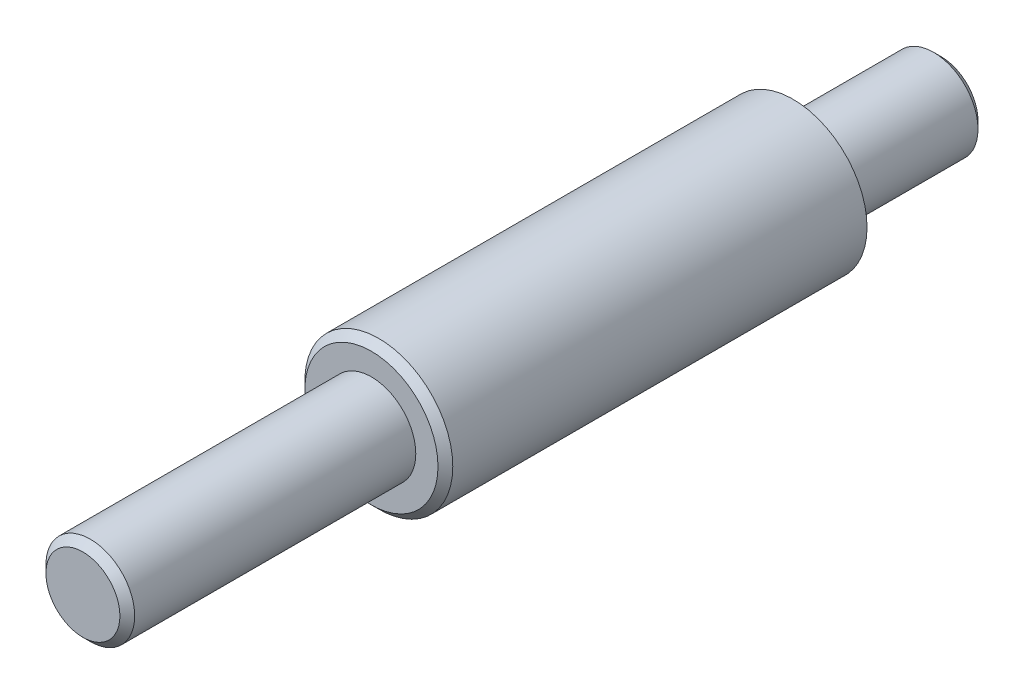
ISO-10303-21;
HEADER;
FILE_DESCRIPTION(('STEP AP214'),'2;1');
FILE_NAME('part.step','',(''),(''),'','','');
FILE_SCHEMA(('AUTOMOTIVE_DESIGN { 1 0 10303 214 1 1 1 1 }'));
ENDSEC;
DATA;
#1=APPLICATION_CONTEXT('core data for automotive mechanical design processes');
#2=APPLICATION_PROTOCOL_DEFINITION('international standard','automotive_design',2000,#1);
#3=PRODUCT_CONTEXT('',#1,'mechanical');
#4=PRODUCT('Part','Part','',(#3));
#5=PRODUCT_RELATED_PRODUCT_CATEGORY('part','',(#4));
#6=PRODUCT_DEFINITION_FORMATION('','',#4);
#7=PRODUCT_DEFINITION_CONTEXT('part definition',#1,'design');
#8=PRODUCT_DEFINITION('design','',#6,#7);
#9=PRODUCT_DEFINITION_SHAPE('','',#8);
#10=(LENGTH_UNIT() NAMED_UNIT(*) SI_UNIT(.MILLI.,.METRE.));
#11=(NAMED_UNIT(*) PLANE_ANGLE_UNIT() SI_UNIT($,.RADIAN.));
#12=(NAMED_UNIT(*) SI_UNIT($,.STERADIAN.) SOLID_ANGLE_UNIT());
#13=UNCERTAINTY_MEASURE_WITH_UNIT(LENGTH_MEASURE(1.E-05),#10,'distance_accuracy_value','');
#14=(GEOMETRIC_REPRESENTATION_CONTEXT(3) GLOBAL_UNCERTAINTY_ASSIGNED_CONTEXT((#13)) GLOBAL_UNIT_ASSIGNED_CONTEXT((#10,
#11,#12)) REPRESENTATION_CONTEXT('',''));
#15=CARTESIAN_POINT('',(0.,0.,0.));
#16=DIRECTION('',(0.,0.,1.));
#17=DIRECTION('',(1.,0.,0.));
#18=AXIS2_PLACEMENT_3D('',#15,#16,#17);
#19=CARTESIAN_POINT('',(0.,0.,0.500000000000001));
#20=DIRECTION('',(0.,0.,1.));
#21=DIRECTION('',(1.,0.,0.));
#22=AXIS2_PLACEMENT_3D('',#19,#20,#21);
#23=CONICAL_SURFACE('',#22,3.,0.78539816339744);
#24=CARTESIAN_POINT('',(0.,0.,0.));
#25=DIRECTION('',(0.,0.,1.));
#26=DIRECTION('',(1.,0.,0.));
#27=AXIS2_PLACEMENT_3D('',#24,#25,#26);
#28=CIRCLE('',#27,2.50000000000001);
#29=CARTESIAN_POINT('',(2.5,0.,0.));
#30=VERTEX_POINT('',#29);
#31=EDGE_CURVE('E69',#30,#30,#28,.T.);
#32=ORIENTED_EDGE('',*,*,#31,.T.);
#33=EDGE_LOOP('',(#32));
#34=FACE_BOUND('',#33,.T.);
#35=CARTESIAN_POINT('',(0.,0.,0.500000000000001));
#36=DIRECTION('',(0.,0.,1.));
#37=DIRECTION('',(1.,0.,0.));
#38=AXIS2_PLACEMENT_3D('',#35,#36,#37);
#39=CIRCLE('',#38,3.);
#40=CARTESIAN_POINT('',(2.99999999999999,0.,0.5));
#41=VERTEX_POINT('',#40);
#42=EDGE_CURVE('E10',#41,#41,#39,.T.);
#43=ORIENTED_EDGE('',*,*,#42,.F.);
#44=EDGE_LOOP('',(#43));
#45=FACE_BOUND('',#44,.T.);
#46=ADVANCED_FACE('F39',(#34,#45),#23,.T.);
#47=CARTESIAN_POINT('',(0.,0.,0.));
#48=DIRECTION('',(0.,0.,1.));
#49=DIRECTION('',(1.,0.,0.));
#50=AXIS2_PLACEMENT_3D('',#47,#48,#49);
#51=CYLINDRICAL_SURFACE('',#50,3.);
#52=ORIENTED_EDGE('',*,*,#42,.T.);
#53=EDGE_LOOP('',(#52));
#54=FACE_BOUND('',#53,.T.);
#55=CARTESIAN_POINT('',(0.,0.,10.));
#56=DIRECTION('',(0.,0.,1.));
#57=DIRECTION('',(1.,0.,0.));
#58=AXIS2_PLACEMENT_3D('',#55,#56,#57);
#59=CIRCLE('',#58,3.);
#60=CARTESIAN_POINT('',(2.99999999999999,0.,10.));
#61=VERTEX_POINT('',#60);
#62=EDGE_CURVE('E44',#61,#61,#59,.T.);
#63=ORIENTED_EDGE('',*,*,#62,.F.);
#64=EDGE_LOOP('',(#63));
#65=FACE_BOUND('',#64,.T.);
#66=ADVANCED_FACE('F90',(#54,#65),#51,.T.);
#67=CARTESIAN_POINT('',(4.99999999999999,0.,10.));
#68=DIRECTION('',(0.,0.,-1.));
#69=DIRECTION('',(-1.,0.,0.));
#70=AXIS2_PLACEMENT_3D('',#67,#68,#69);
#71=PLANE('',#70);
#72=ORIENTED_EDGE('',*,*,#62,.T.);
#73=EDGE_LOOP('',(#72));
#74=FACE_BOUND('',#73,.T.);
#75=CARTESIAN_POINT('',(0.,0.,10.));
#76=DIRECTION('',(0.,0.,1.));
#77=DIRECTION('',(1.,0.,0.));
#78=AXIS2_PLACEMENT_3D('',#75,#76,#77);
#79=CIRCLE('',#78,5.);
#80=CARTESIAN_POINT('',(4.99999999999999,0.,10.));
#81=VERTEX_POINT('',#80);
#82=EDGE_CURVE('E47',#81,#81,#79,.T.);
#83=ORIENTED_EDGE('',*,*,#82,.F.);
#84=EDGE_LOOP('',(#83));
#85=FACE_BOUND('',#84,.T.);
#86=ADVANCED_FACE('F91',(#74,#85),#71,.T.);
#87=CARTESIAN_POINT('',(0.,0.,0.));
#88=DIRECTION('',(0.,0.,1.));
#89=DIRECTION('',(1.,0.,0.));
#90=AXIS2_PLACEMENT_3D('',#87,#88,#89);
#91=CYLINDRICAL_SURFACE('',#90,5.);
#92=ORIENTED_EDGE('',*,*,#82,.T.);
#93=EDGE_LOOP('',(#92));
#94=FACE_BOUND('',#93,.T.);
#95=CARTESIAN_POINT('',(0.,0.,38.));
#96=DIRECTION('',(0.,0.,1.));
#97=DIRECTION('',(1.,0.,0.));
#98=AXIS2_PLACEMENT_3D('',#95,#96,#97);
#99=CIRCLE('',#98,5.);
#100=CARTESIAN_POINT('',(5.,0.,38.));
#101=VERTEX_POINT('',#100);
#102=EDGE_CURVE('E52',#101,#101,#99,.T.);
#103=ORIENTED_EDGE('',*,*,#102,.F.);
#104=EDGE_LOOP('',(#103));
#105=FACE_BOUND('',#104,.T.);
#106=ADVANCED_FACE('F95',(#94,#105),#91,.T.);
#107=CARTESIAN_POINT('',(0.,0.,38.5));
#108=DIRECTION('',(0.,0.,-1.));
#109=DIRECTION('',(-1.,0.,0.));
#110=AXIS2_PLACEMENT_3D('',#107,#108,#109);
#111=CONICAL_SURFACE('',#110,4.5,0.785398163397448);
#112=ORIENTED_EDGE('',*,*,#102,.T.);
#113=EDGE_LOOP('',(#112));
#114=FACE_BOUND('',#113,.T.);
#115=CARTESIAN_POINT('',(0.,0.,38.5));
#116=DIRECTION('',(0.,0.,1.));
#117=DIRECTION('',(1.,0.,0.));
#118=AXIS2_PLACEMENT_3D('',#115,#116,#117);
#119=CIRCLE('',#118,4.5);
#120=CARTESIAN_POINT('',(4.5,0.,38.5));
#121=VERTEX_POINT('',#120);
#122=EDGE_CURVE('E59',#121,#121,#119,.T.);
#123=ORIENTED_EDGE('',*,*,#122,.F.);
#124=EDGE_LOOP('',(#123));
#125=FACE_BOUND('',#124,.T.);
#126=ADVANCED_FACE('F103',(#114,#125),#111,.T.);
#127=CARTESIAN_POINT('',(2.99999999999999,0.,38.5));
#128=DIRECTION('',(0.,0.,1.));
#129=DIRECTION('',(1.,0.,0.));
#130=AXIS2_PLACEMENT_3D('',#127,#128,#129);
#131=PLANE('',#130);
#132=ORIENTED_EDGE('',*,*,#122,.T.);
#133=EDGE_LOOP('',(#132));
#134=FACE_BOUND('',#133,.T.);
#135=CARTESIAN_POINT('',(0.,0.,38.5));
#136=DIRECTION('',(0.,0.,1.));
#137=DIRECTION('',(1.,0.,0.));
#138=AXIS2_PLACEMENT_3D('',#135,#136,#137);
#139=CIRCLE('',#138,2.99999999999999);
#140=CARTESIAN_POINT('',(2.99999999999999,0.,38.5));
#141=VERTEX_POINT('',#140);
#142=EDGE_CURVE('E62',#141,#141,#139,.T.);
#143=ORIENTED_EDGE('',*,*,#142,.F.);
#144=EDGE_LOOP('',(#143));
#145=FACE_BOUND('',#144,.T.);
#146=ADVANCED_FACE('F102',(#134,#145),#131,.T.);
#147=CARTESIAN_POINT('',(0.,0.,0.));
#148=DIRECTION('',(0.,0.,1.));
#149=DIRECTION('',(1.,0.,0.));
#150=AXIS2_PLACEMENT_3D('',#147,#148,#149);
#151=CYLINDRICAL_SURFACE('',#150,2.99999999999999);
#152=ORIENTED_EDGE('',*,*,#142,.T.);
#153=EDGE_LOOP('',(#152));
#154=FACE_BOUND('',#153,.T.);
#155=CARTESIAN_POINT('',(0.,0.,57.5));
#156=DIRECTION('',(0.,0.,1.));
#157=DIRECTION('',(1.,0.,0.));
#158=AXIS2_PLACEMENT_3D('',#155,#156,#157);
#159=CIRCLE('',#158,3.);
#160=CARTESIAN_POINT('',(3.,0.,57.5));
#161=VERTEX_POINT('',#160);
#162=EDGE_CURVE('E61',#161,#161,#159,.T.);
#163=ORIENTED_EDGE('',*,*,#162,.F.);
#164=EDGE_LOOP('',(#163));
#165=FACE_BOUND('',#164,.T.);
#166=ADVANCED_FACE('F107',(#154,#165),#151,.T.);
#167=CARTESIAN_POINT('',(0.,0.,58.));
#168=DIRECTION('',(0.,0.,-1.));
#169=DIRECTION('',(-1.,0.,0.));
#170=AXIS2_PLACEMENT_3D('',#167,#168,#169);
#171=CONICAL_SURFACE('',#170,2.5,0.785398163397444);
#172=ORIENTED_EDGE('',*,*,#162,.T.);
#173=EDGE_LOOP('',(#172));
#174=FACE_BOUND('',#173,.T.);
#175=CARTESIAN_POINT('',(0.,0.,58.));
#176=DIRECTION('',(0.,0.,1.));
#177=DIRECTION('',(1.,0.,0.));
#178=AXIS2_PLACEMENT_3D('',#175,#176,#177);
#179=CIRCLE('',#178,2.5);
#180=CARTESIAN_POINT('',(2.5,0.,58.));
#181=VERTEX_POINT('',#180);
#182=EDGE_CURVE('E70',#181,#181,#179,.T.);
#183=ORIENTED_EDGE('',*,*,#182,.F.);
#184=EDGE_LOOP('',(#183));
#185=FACE_BOUND('',#184,.T.);
#186=ADVANCED_FACE('F84',(#174,#185),#171,.T.);
#187=CARTESIAN_POINT('',(0.,0.,58.));
#188=DIRECTION('',(0.,0.,1.));
#189=DIRECTION('',(1.,0.,0.));
#190=AXIS2_PLACEMENT_3D('',#187,#188,#189);
#191=PLANE('',#190);
#192=ORIENTED_EDGE('',*,*,#182,.T.);
#193=EDGE_LOOP('',(#192));
#194=FACE_BOUND('',#193,.T.);
#195=ADVANCED_FACE('F76',(#194),#191,.T.);
#196=CARTESIAN_POINT('',(2.5,0.,0.));
#197=DIRECTION('',(0.,0.,-1.));
#198=DIRECTION('',(-1.,0.,0.));
#199=AXIS2_PLACEMENT_3D('',#196,#197,#198);
#200=PLANE('',#199);
#201=ORIENTED_EDGE('',*,*,#31,.F.);
#202=EDGE_LOOP('',(#201));
#203=FACE_BOUND('',#202,.T.);
#204=ADVANCED_FACE('F77',(#203),#200,.T.);
#205=CLOSED_SHELL('',(#46,#66,#86,#106,#126,#146,#166,#186,#195,#204));
#206=MANIFOLD_SOLID_BREP('B2',#205);
#207=ADVANCED_BREP_SHAPE_REPRESENTATION('',(#18,#206),#14);
#208=SHAPE_DEFINITION_REPRESENTATION(#9,#207);
ENDSEC;
END-ISO-10303-21;
